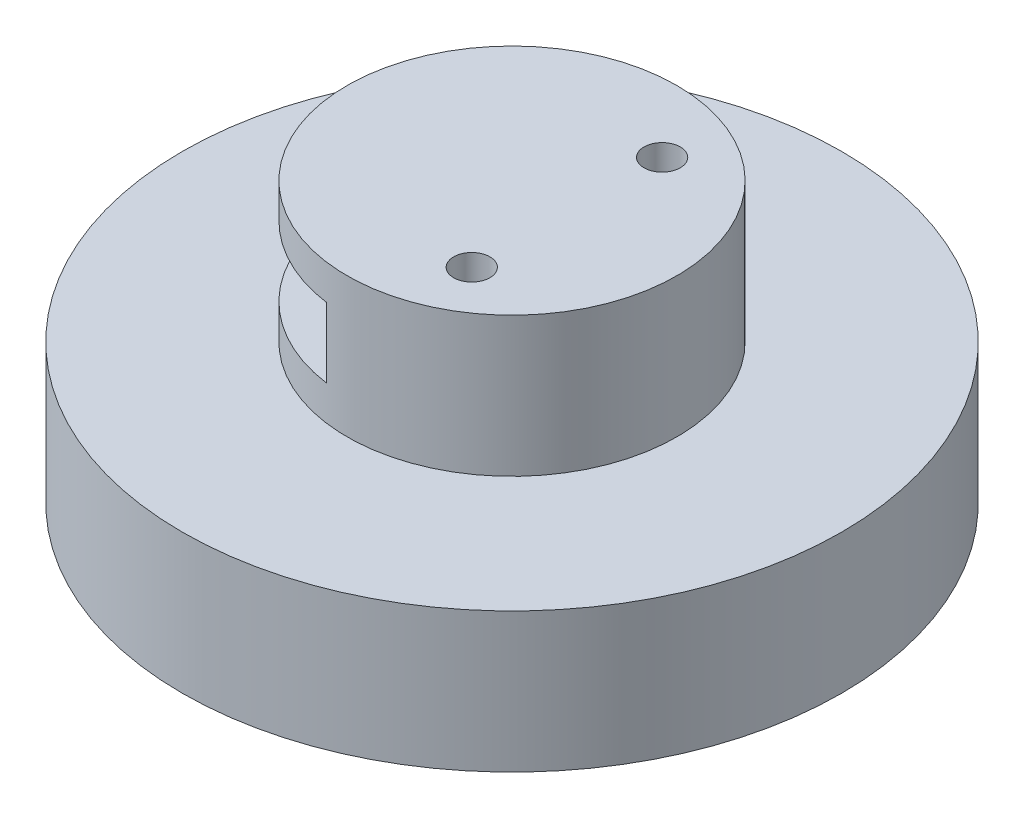
ISO-10303-21;
HEADER;
FILE_DESCRIPTION(('STEP AP214'),'2;1');
FILE_NAME('part.step','',(''),(''),'','','');
FILE_SCHEMA(('AUTOMOTIVE_DESIGN { 1 0 10303 214 1 1 1 1 }'));
ENDSEC;
DATA;
#1=APPLICATION_CONTEXT('core data for automotive mechanical design processes');
#2=APPLICATION_PROTOCOL_DEFINITION('international standard','automotive_design',2000,#1);
#3=PRODUCT_CONTEXT('',#1,'mechanical');
#4=PRODUCT('Part','Part','',(#3));
#5=PRODUCT_RELATED_PRODUCT_CATEGORY('part','',(#4));
#6=PRODUCT_DEFINITION_FORMATION('','',#4);
#7=PRODUCT_DEFINITION_CONTEXT('part definition',#1,'design');
#8=PRODUCT_DEFINITION('design','',#6,#7);
#9=PRODUCT_DEFINITION_SHAPE('','',#8);
#10=(LENGTH_UNIT() NAMED_UNIT(*) SI_UNIT(.MILLI.,.METRE.));
#11=(NAMED_UNIT(*) PLANE_ANGLE_UNIT() SI_UNIT($,.RADIAN.));
#12=(NAMED_UNIT(*) SI_UNIT($,.STERADIAN.) SOLID_ANGLE_UNIT());
#13=UNCERTAINTY_MEASURE_WITH_UNIT(LENGTH_MEASURE(1.E-05),#10,'distance_accuracy_value','');
#14=(GEOMETRIC_REPRESENTATION_CONTEXT(3) GLOBAL_UNCERTAINTY_ASSIGNED_CONTEXT((#13)) GLOBAL_UNIT_ASSIGNED_CONTEXT((#10,
#11,#12)) REPRESENTATION_CONTEXT('',''));
#15=CARTESIAN_POINT('',(0.,0.,0.));
#16=DIRECTION('',(0.,0.,1.));
#17=DIRECTION('',(1.,0.,0.));
#18=AXIS2_PLACEMENT_3D('',#15,#16,#17);
#19=CARTESIAN_POINT('',(0.,12.7,0.));
#20=DIRECTION('',(0.,-1.,0.));
#21=DIRECTION('',(0.,0.,-1.));
#22=AXIS2_PLACEMENT_3D('',#19,#20,#21);
#23=PLANE('',#22);
#24=CARTESIAN_POINT('',(4.99999999999998,12.7,-8.6602540378444));
#25=DIRECTION('',(0.,1.,0.));
#26=DIRECTION('',(0.,0.,1.));
#27=AXIS2_PLACEMENT_3D('',#24,#25,#26);
#28=CIRCLE('',#27,1.64999999999999);
#29=CARTESIAN_POINT('',(4.99999999999998,12.7,-7.01025403784441));
#30=VERTEX_POINT('',#29);
#31=EDGE_CURVE('E129',#30,#30,#28,.T.);
#32=ORIENTED_EDGE('',*,*,#31,.F.);
#33=EDGE_LOOP('',(#32));
#34=FACE_BOUND('',#33,.T.);
#35=CARTESIAN_POINT('',(5.00000000000004,12.7,8.66025403784436));
#36=DIRECTION('',(0.,1.,0.));
#37=DIRECTION('',(0.,0.,1.));
#38=AXIS2_PLACEMENT_3D('',#35,#36,#37);
#39=CIRCLE('',#38,1.64999999999999);
#40=CARTESIAN_POINT('',(5.00000000000004,12.7,10.3102540378444));
#41=VERTEX_POINT('',#40);
#42=EDGE_CURVE('E137',#41,#41,#39,.T.);
#43=ORIENTED_EDGE('',*,*,#42,.F.);
#44=EDGE_LOOP('',(#43));
#45=FACE_BOUND('',#44,.T.);
#46=CARTESIAN_POINT('',(0.,12.7,0.));
#47=DIRECTION('',(0.,-1.,0.));
#48=DIRECTION('',(0.,0.,-1.));
#49=AXIS2_PLACEMENT_3D('',#46,#47,#48);
#50=CIRCLE('',#49,15.);
#51=CARTESIAN_POINT('',(0.,12.7,-15.));
#52=VERTEX_POINT('',#51);
#53=EDGE_CURVE('E162',#52,#52,#50,.T.);
#54=ORIENTED_EDGE('',*,*,#53,.F.);
#55=EDGE_LOOP('',(#54));
#56=FACE_BOUND('',#55,.T.);
#57=ADVANCED_FACE('F45',(#34,#45,#56),#23,.F.);
#58=CARTESIAN_POINT('',(0.,-12.7,0.));
#59=DIRECTION('',(0.,-1.,0.));
#60=DIRECTION('',(0.,0.,-1.));
#61=AXIS2_PLACEMENT_3D('',#58,#59,#60);
#62=CYLINDRICAL_SURFACE('',#61,15.);
#63=DIRECTION('',(0.,-1.,0.));
#64=VECTOR('',#63,1.);
#65=CARTESIAN_POINT('',(-2.,-12.7,-14.8660687473185));
#66=LINE('',#65,#64);
#67=CARTESIAN_POINT('',(-2.,3.175,-14.8660687473185));
#68=VERTEX_POINT('',#67);
#69=CARTESIAN_POINT('',(-2.,9.52499999999999,-14.8660687473185));
#70=VERTEX_POINT('',#69);
#71=EDGE_CURVE('E170',#68,#70,#66,.F.);
#72=ORIENTED_EDGE('',*,*,#71,.T.);
#73=CARTESIAN_POINT('',(0.,9.52499999999999,0.));
#74=DIRECTION('',(0.,1.,0.));
#75=DIRECTION('',(0.,0.,1.));
#76=AXIS2_PLACEMENT_3D('',#73,#74,#75);
#77=CIRCLE('',#76,15.);
#78=CARTESIAN_POINT('',(-2.,9.52499999999999,14.8660687473185));
#79=VERTEX_POINT('',#78);
#80=EDGE_CURVE('E11',#70,#79,#77,.T.);
#81=ORIENTED_EDGE('',*,*,#80,.T.);
#82=DIRECTION('',(0.,-1.,0.));
#83=VECTOR('',#82,1.);
#84=CARTESIAN_POINT('',(-2.,-12.7,14.8660687473185));
#85=LINE('',#84,#83);
#86=CARTESIAN_POINT('',(-2.,3.175,14.8660687473185));
#87=VERTEX_POINT('',#86);
#88=EDGE_CURVE('E53',#79,#87,#85,.T.);
#89=ORIENTED_EDGE('',*,*,#88,.T.);
#90=CARTESIAN_POINT('',(0.,3.175,0.));
#91=DIRECTION('',(0.,-1.,0.));
#92=DIRECTION('',(1.,0.,0.));
#93=AXIS2_PLACEMENT_3D('',#90,#91,#92);
#94=CIRCLE('',#93,15.);
#95=EDGE_CURVE('E166',#87,#68,#94,.T.);
#96=ORIENTED_EDGE('',*,*,#95,.T.);
#97=EDGE_LOOP('',(#72,#81,#89,#96));
#98=FACE_BOUND('',#97,.T.);
#99=CARTESIAN_POINT('',(0.,0.,0.));
#100=DIRECTION('',(0.,-1.,0.));
#101=DIRECTION('',(0.,0.,-1.));
#102=AXIS2_PLACEMENT_3D('',#99,#100,#101);
#103=CIRCLE('',#102,15.);
#104=CARTESIAN_POINT('',(0.,0.,-15.));
#105=VERTEX_POINT('',#104);
#106=EDGE_CURVE('E158',#105,#105,#103,.T.);
#107=ORIENTED_EDGE('',*,*,#106,.F.);
#108=EDGE_LOOP('',(#107));
#109=FACE_BOUND('',#108,.T.);
#110=ORIENTED_EDGE('',*,*,#53,.T.);
#111=EDGE_LOOP('',(#110));
#112=FACE_BOUND('',#111,.T.);
#113=ADVANCED_FACE('F175',(#98,#109,#112),#62,.T.);
#114=CARTESIAN_POINT('',(-15.,0.,0.));
#115=DIRECTION('',(0.,-1.,0.));
#116=DIRECTION('',(0.,0.,-1.));
#117=AXIS2_PLACEMENT_3D('',#114,#115,#116);
#118=PLANE('',#117);
#119=CARTESIAN_POINT('',(0.,0.,0.));
#120=DIRECTION('',(0.,-1.,0.));
#121=DIRECTION('',(0.,0.,-1.));
#122=AXIS2_PLACEMENT_3D('',#119,#120,#121);
#123=CIRCLE('',#122,30.);
#124=CARTESIAN_POINT('',(0.,0.,-30.));
#125=VERTEX_POINT('',#124);
#126=EDGE_CURVE('E154',#125,#125,#123,.T.);
#127=ORIENTED_EDGE('',*,*,#126,.F.);
#128=EDGE_LOOP('',(#127));
#129=FACE_BOUND('',#128,.T.);
#130=ORIENTED_EDGE('',*,*,#106,.T.);
#131=EDGE_LOOP('',(#130));
#132=FACE_BOUND('',#131,.T.);
#133=ADVANCED_FACE('F196',(#129,#132),#118,.F.);
#134=CARTESIAN_POINT('',(0.,-12.7,0.));
#135=DIRECTION('',(0.,-1.,0.));
#136=DIRECTION('',(0.,0.,-1.));
#137=AXIS2_PLACEMENT_3D('',#134,#135,#136);
#138=CYLINDRICAL_SURFACE('',#137,30.);
#139=CARTESIAN_POINT('',(0.,-12.7,0.));
#140=DIRECTION('',(0.,-1.,0.));
#141=DIRECTION('',(0.,0.,-1.));
#142=AXIS2_PLACEMENT_3D('',#139,#140,#141);
#143=CIRCLE('',#142,30.);
#144=CARTESIAN_POINT('',(0.,-12.7,-30.));
#145=VERTEX_POINT('',#144);
#146=EDGE_CURVE('E148',#145,#145,#143,.T.);
#147=ORIENTED_EDGE('',*,*,#146,.F.);
#148=EDGE_LOOP('',(#147));
#149=FACE_BOUND('',#148,.T.);
#150=ORIENTED_EDGE('',*,*,#126,.T.);
#151=EDGE_LOOP('',(#150));
#152=FACE_BOUND('',#151,.T.);
#153=ADVANCED_FACE('F246',(#149,#152),#138,.T.);
#154=CARTESIAN_POINT('',(-30.,-12.7,0.));
#155=DIRECTION('',(0.,1.,0.));
#156=DIRECTION('',(0.,0.,1.));
#157=AXIS2_PLACEMENT_3D('',#154,#155,#156);
#158=PLANE('',#157);
#159=CARTESIAN_POINT('',(20.,-12.7,0.));
#160=DIRECTION('',(0.,-1.,0.));
#161=DIRECTION('',(0.,0.,-1.));
#162=AXIS2_PLACEMENT_3D('',#159,#160,#161);
#163=CIRCLE('',#162,1.64999999999999);
#164=CARTESIAN_POINT('',(20.,-12.7,-1.64999999999999));
#165=VERTEX_POINT('',#164);
#166=EDGE_CURVE('E108',#165,#165,#163,.T.);
#167=ORIENTED_EDGE('',*,*,#166,.F.);
#168=EDGE_LOOP('',(#167));
#169=FACE_BOUND('',#168,.T.);
#170=CARTESIAN_POINT('',(-9.99999999999996,-12.7,17.3205080756888));
#171=DIRECTION('',(0.,-1.,0.));
#172=DIRECTION('',(0.,0.,-1.));
#173=AXIS2_PLACEMENT_3D('',#170,#171,#172);
#174=CIRCLE('',#173,1.64999999999999);
#175=CARTESIAN_POINT('',(-9.99999999999996,-12.7,15.6705080756888));
#176=VERTEX_POINT('',#175);
#177=EDGE_CURVE('E107',#176,#176,#174,.T.);
#178=ORIENTED_EDGE('',*,*,#177,.F.);
#179=EDGE_LOOP('',(#178));
#180=FACE_BOUND('',#179,.T.);
#181=CARTESIAN_POINT('',(-9.99999999999996,-12.7,-17.3205080756888));
#182=DIRECTION('',(0.,-1.,0.));
#183=DIRECTION('',(0.,0.,-1.));
#184=AXIS2_PLACEMENT_3D('',#181,#182,#183);
#185=CIRCLE('',#184,1.64999999999999);
#186=CARTESIAN_POINT('',(-9.99999999999996,-12.7,-18.9705080756888));
#187=VERTEX_POINT('',#186);
#188=EDGE_CURVE('E121',#187,#187,#185,.T.);
#189=ORIENTED_EDGE('',*,*,#188,.F.);
#190=EDGE_LOOP('',(#189));
#191=FACE_BOUND('',#190,.T.);
#192=ORIENTED_EDGE('',*,*,#146,.T.);
#193=EDGE_LOOP('',(#192));
#194=FACE_BOUND('',#193,.T.);
#195=ADVANCED_FACE('F189',(#169,#180,#191,#194),#158,.F.);
#196=CARTESIAN_POINT('',(-15.,9.52499999999999,-30.));
#197=DIRECTION('',(0.,1.,0.));
#198=DIRECTION('',(0.,0.,1.));
#199=AXIS2_PLACEMENT_3D('',#196,#197,#198);
#200=PLANE('',#199);
#201=DIRECTION('',(0.,0.,1.));
#202=VECTOR('',#201,1.);
#203=CARTESIAN_POINT('',(-2.,9.52499999999999,-30.));
#204=LINE('',#203,#202);
#205=EDGE_CURVE('E145',#70,#79,#204,.T.);
#206=ORIENTED_EDGE('',*,*,#205,.T.);
#207=ORIENTED_EDGE('',*,*,#80,.F.);
#208=EDGE_LOOP('',(#206,#207));
#209=FACE_BOUND('',#208,.T.);
#210=ADVANCED_FACE('F178',(#209),#200,.F.);
#211=CARTESIAN_POINT('',(-2.,9.52499999999999,-30.));
#212=DIRECTION('',(1.,0.,0.));
#213=DIRECTION('',(0.,0.,-1.));
#214=AXIS2_PLACEMENT_3D('',#211,#212,#213);
#215=PLANE('',#214);
#216=ORIENTED_EDGE('',*,*,#205,.F.);
#217=ORIENTED_EDGE('',*,*,#71,.F.);
#218=DIRECTION('',(0.,0.,1.));
#219=VECTOR('',#218,1.);
#220=CARTESIAN_POINT('',(-2.,3.175,-30.));
#221=LINE('',#220,#219);
#222=EDGE_CURVE('E62',#68,#87,#221,.T.);
#223=ORIENTED_EDGE('',*,*,#222,.T.);
#224=ORIENTED_EDGE('',*,*,#88,.F.);
#225=EDGE_LOOP('',(#216,#217,#223,#224));
#226=FACE_BOUND('',#225,.T.);
#227=ADVANCED_FACE('F179',(#226),#215,.F.);
#228=CARTESIAN_POINT('',(-15.,3.175,-30.));
#229=DIRECTION('',(0.,-1.,0.));
#230=DIRECTION('',(1.,0.,0.));
#231=AXIS2_PLACEMENT_3D('',#228,#229,#230);
#232=PLANE('',#231);
#233=ORIENTED_EDGE('',*,*,#222,.F.);
#234=ORIENTED_EDGE('',*,*,#95,.F.);
#235=EDGE_LOOP('',(#233,#234));
#236=FACE_BOUND('',#235,.T.);
#237=ADVANCED_FACE('F181',(#236),#232,.F.);
#238=CARTESIAN_POINT('',(5.00000000000004,2.6,8.66025403784436));
#239=DIRECTION('',(0.,1.,0.));
#240=DIRECTION('',(0.,0.,1.));
#241=AXIS2_PLACEMENT_3D('',#238,#239,#240);
#242=CONICAL_SURFACE('',#241,1.64999999999999,1.02974425867665);
#243=CARTESIAN_POINT('',(5.00000000000004,1.60857997860452,8.66025403784436));
#244=VERTEX_POINT('',#243);
#245=VERTEX_LOOP('',#244);
#246=FACE_BOUND('',#245,.T.);
#247=CARTESIAN_POINT('',(5.00000000000004,2.6,8.66025403784436));
#248=DIRECTION('',(0.,1.,0.));
#249=DIRECTION('',(0.,0.,1.));
#250=AXIS2_PLACEMENT_3D('',#247,#248,#249);
#251=CIRCLE('',#250,1.64999999999999);
#252=CARTESIAN_POINT('',(5.00000000000004,2.6,10.3102540378444));
#253=VERTEX_POINT('',#252);
#254=EDGE_CURVE('E141',#253,#253,#251,.T.);
#255=ORIENTED_EDGE('',*,*,#254,.T.);
#256=EDGE_LOOP('',(#255));
#257=FACE_BOUND('',#256,.T.);
#258=ADVANCED_FACE('F187',(#246,#257),#242,.F.);
#259=CARTESIAN_POINT('',(5.00000000000004,12.7,8.66025403784436));
#260=DIRECTION('',(0.,1.,0.));
#261=DIRECTION('',(0.,0.,1.));
#262=AXIS2_PLACEMENT_3D('',#259,#260,#261);
#263=CYLINDRICAL_SURFACE('',#262,1.64999999999999);
#264=ORIENTED_EDGE('',*,*,#254,.F.);
#265=EDGE_LOOP('',(#264));
#266=FACE_BOUND('',#265,.T.);
#267=ORIENTED_EDGE('',*,*,#42,.T.);
#268=EDGE_LOOP('',(#267));
#269=FACE_BOUND('',#268,.T.);
#270=ADVANCED_FACE('F204',(#266,#269),#263,.F.);
#271=CARTESIAN_POINT('',(4.99999999999998,2.6,-8.6602540378444));
#272=DIRECTION('',(0.,1.,0.));
#273=DIRECTION('',(0.,0.,1.));
#274=AXIS2_PLACEMENT_3D('',#271,#272,#273);
#275=CONICAL_SURFACE('',#274,1.64999999999999,1.02974425867665);
#276=CARTESIAN_POINT('',(4.99999999999998,1.60857997860452,-8.6602540378444));
#277=VERTEX_POINT('',#276);
#278=VERTEX_LOOP('',#277);
#279=FACE_BOUND('',#278,.T.);
#280=CARTESIAN_POINT('',(4.99999999999998,2.6,-8.6602540378444));
#281=DIRECTION('',(0.,1.,0.));
#282=DIRECTION('',(0.,0.,1.));
#283=AXIS2_PLACEMENT_3D('',#280,#281,#282);
#284=CIRCLE('',#283,1.64999999999999);
#285=CARTESIAN_POINT('',(4.99999999999998,2.6,-7.01025403784441));
#286=VERTEX_POINT('',#285);
#287=EDGE_CURVE('E133',#286,#286,#284,.T.);
#288=ORIENTED_EDGE('',*,*,#287,.T.);
#289=EDGE_LOOP('',(#288));
#290=FACE_BOUND('',#289,.T.);
#291=ADVANCED_FACE('F206',(#279,#290),#275,.F.);
#292=CARTESIAN_POINT('',(4.99999999999998,12.7,-8.6602540378444));
#293=DIRECTION('',(0.,1.,0.));
#294=DIRECTION('',(0.,0.,1.));
#295=AXIS2_PLACEMENT_3D('',#292,#293,#294);
#296=CYLINDRICAL_SURFACE('',#295,1.64999999999999);
#297=ORIENTED_EDGE('',*,*,#287,.F.);
#298=EDGE_LOOP('',(#297));
#299=FACE_BOUND('',#298,.T.);
#300=ORIENTED_EDGE('',*,*,#31,.T.);
#301=EDGE_LOOP('',(#300));
#302=FACE_BOUND('',#301,.T.);
#303=ADVANCED_FACE('F213',(#299,#302),#296,.F.);
#304=CARTESIAN_POINT('',(-9.99999999999996,-2.6,-17.3205080756888));
#305=DIRECTION('',(0.,-1.,0.));
#306=DIRECTION('',(0.,0.,-1.));
#307=AXIS2_PLACEMENT_3D('',#304,#305,#306);
#308=CONICAL_SURFACE('',#307,1.64999999999999,1.02974425867665);
#309=CARTESIAN_POINT('',(-9.99999999999996,-1.60857997860452,-17.3205080756888));
#310=VERTEX_POINT('',#309);
#311=VERTEX_LOOP('',#310);
#312=FACE_BOUND('',#311,.T.);
#313=CARTESIAN_POINT('',(-9.99999999999996,-2.6,-17.3205080756888));
#314=DIRECTION('',(0.,-1.,0.));
#315=DIRECTION('',(0.,0.,-1.));
#316=AXIS2_PLACEMENT_3D('',#313,#314,#315);
#317=CIRCLE('',#316,1.64999999999999);
#318=CARTESIAN_POINT('',(-9.99999999999996,-2.6,-18.9705080756888));
#319=VERTEX_POINT('',#318);
#320=EDGE_CURVE('E125',#319,#319,#317,.T.);
#321=ORIENTED_EDGE('',*,*,#320,.T.);
#322=EDGE_LOOP('',(#321));
#323=FACE_BOUND('',#322,.T.);
#324=ADVANCED_FACE('F222',(#312,#323),#308,.F.);
#325=CARTESIAN_POINT('',(-9.99999999999996,-12.7,-17.3205080756888));
#326=DIRECTION('',(0.,-1.,0.));
#327=DIRECTION('',(0.,0.,-1.));
#328=AXIS2_PLACEMENT_3D('',#325,#326,#327);
#329=CYLINDRICAL_SURFACE('',#328,1.64999999999999);
#330=ORIENTED_EDGE('',*,*,#320,.F.);
#331=EDGE_LOOP('',(#330));
#332=FACE_BOUND('',#331,.T.);
#333=ORIENTED_EDGE('',*,*,#188,.T.);
#334=EDGE_LOOP('',(#333));
#335=FACE_BOUND('',#334,.T.);
#336=ADVANCED_FACE('F226',(#332,#335),#329,.F.);
#337=CARTESIAN_POINT('',(-9.99999999999996,-2.6,17.3205080756888));
#338=DIRECTION('',(0.,-1.,0.));
#339=DIRECTION('',(0.,0.,-1.));
#340=AXIS2_PLACEMENT_3D('',#337,#338,#339);
#341=CONICAL_SURFACE('',#340,1.64999999999999,1.02974425867665);
#342=CARTESIAN_POINT('',(-9.99999999999996,-1.60857997860452,17.3205080756888));
#343=VERTEX_POINT('',#342);
#344=VERTEX_LOOP('',#343);
#345=FACE_BOUND('',#344,.T.);
#346=CARTESIAN_POINT('',(-9.99999999999996,-2.6,17.3205080756888));
#347=DIRECTION('',(0.,-1.,0.));
#348=DIRECTION('',(0.,0.,-1.));
#349=AXIS2_PLACEMENT_3D('',#346,#347,#348);
#350=CIRCLE('',#349,1.64999999999999);
#351=CARTESIAN_POINT('',(-9.99999999999996,-2.6,15.6705080756888));
#352=VERTEX_POINT('',#351);
#353=EDGE_CURVE('E113',#352,#352,#350,.T.);
#354=ORIENTED_EDGE('',*,*,#353,.T.);
#355=EDGE_LOOP('',(#354));
#356=FACE_BOUND('',#355,.T.);
#357=ADVANCED_FACE('F230',(#345,#356),#341,.F.);
#358=CARTESIAN_POINT('',(-9.99999999999996,-12.7,17.3205080756888));
#359=DIRECTION('',(0.,-1.,0.));
#360=DIRECTION('',(0.,0.,-1.));
#361=AXIS2_PLACEMENT_3D('',#358,#359,#360);
#362=CYLINDRICAL_SURFACE('',#361,1.64999999999999);
#363=ORIENTED_EDGE('',*,*,#353,.F.);
#364=EDGE_LOOP('',(#363));
#365=FACE_BOUND('',#364,.T.);
#366=ORIENTED_EDGE('',*,*,#177,.T.);
#367=EDGE_LOOP('',(#366));
#368=FACE_BOUND('',#367,.T.);
#369=ADVANCED_FACE('F100',(#365,#368),#362,.F.);
#370=CARTESIAN_POINT('',(20.,-2.6,0.));
#371=DIRECTION('',(0.,-1.,0.));
#372=DIRECTION('',(0.,0.,-1.));
#373=AXIS2_PLACEMENT_3D('',#370,#371,#372);
#374=CONICAL_SURFACE('',#373,1.64999999999999,1.02974425867665);
#375=CARTESIAN_POINT('',(20.,-1.60857997860452,0.));
#376=VERTEX_POINT('',#375);
#377=VERTEX_LOOP('',#376);
#378=FACE_BOUND('',#377,.T.);
#379=CARTESIAN_POINT('',(20.,-2.6,0.));
#380=DIRECTION('',(0.,-1.,0.));
#381=DIRECTION('',(0.,0.,-1.));
#382=AXIS2_PLACEMENT_3D('',#379,#380,#381);
#383=CIRCLE('',#382,1.64999999999999);
#384=CARTESIAN_POINT('',(20.,-2.6,-1.64999999999999));
#385=VERTEX_POINT('',#384);
#386=EDGE_CURVE('E104',#385,#385,#383,.T.);
#387=ORIENTED_EDGE('',*,*,#386,.T.);
#388=EDGE_LOOP('',(#387));
#389=FACE_BOUND('',#388,.T.);
#390=ADVANCED_FACE('F96',(#378,#389),#374,.F.);
#391=CARTESIAN_POINT('',(20.,-12.7,0.));
#392=DIRECTION('',(0.,-1.,0.));
#393=DIRECTION('',(0.,0.,-1.));
#394=AXIS2_PLACEMENT_3D('',#391,#392,#393);
#395=CYLINDRICAL_SURFACE('',#394,1.64999999999999);
#396=ORIENTED_EDGE('',*,*,#386,.F.);
#397=EDGE_LOOP('',(#396));
#398=FACE_BOUND('',#397,.T.);
#399=ORIENTED_EDGE('',*,*,#166,.T.);
#400=EDGE_LOOP('',(#399));
#401=FACE_BOUND('',#400,.T.);
#402=ADVANCED_FACE('F99',(#398,#401),#395,.F.);
#403=CLOSED_SHELL('',(#57,#113,#133,#153,#195,#210,#227,#237,#258,#270,#291,#303,#324,#336,#357,
#369,#390,#402));
#404=MANIFOLD_SOLID_BREP('B2',#403);
#405=ADVANCED_BREP_SHAPE_REPRESENTATION('',(#18,#404),#14);
#406=SHAPE_DEFINITION_REPRESENTATION(#9,#405);
ENDSEC;
END-ISO-10303-21;
